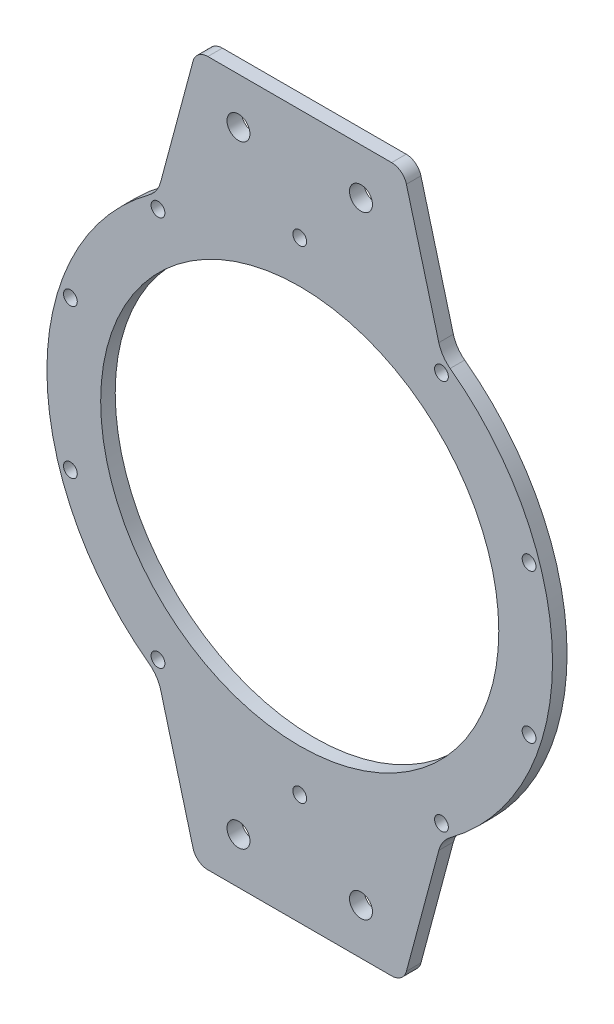
ISO-10303-21;
HEADER;
FILE_DESCRIPTION(('STEP AP214'),'2;1');
FILE_NAME('part.step','',(''),(''),'','','');
FILE_SCHEMA(('AUTOMOTIVE_DESIGN { 1 0 10303 214 1 1 1 1 }'));
ENDSEC;
DATA;
#1=APPLICATION_CONTEXT('core data for automotive mechanical design processes');
#2=APPLICATION_PROTOCOL_DEFINITION('international standard','automotive_design',2000,#1);
#3=PRODUCT_CONTEXT('',#1,'mechanical');
#4=PRODUCT('Part','Part','',(#3));
#5=PRODUCT_RELATED_PRODUCT_CATEGORY('part','',(#4));
#6=PRODUCT_DEFINITION_FORMATION('','',#4);
#7=PRODUCT_DEFINITION_CONTEXT('part definition',#1,'design');
#8=PRODUCT_DEFINITION('design','',#6,#7);
#9=PRODUCT_DEFINITION_SHAPE('','',#8);
#10=(LENGTH_UNIT() NAMED_UNIT(*) SI_UNIT(.MILLI.,.METRE.));
#11=(NAMED_UNIT(*) PLANE_ANGLE_UNIT() SI_UNIT($,.RADIAN.));
#12=(NAMED_UNIT(*) SI_UNIT($,.STERADIAN.) SOLID_ANGLE_UNIT());
#13=UNCERTAINTY_MEASURE_WITH_UNIT(LENGTH_MEASURE(1.E-05),#10,'distance_accuracy_value','');
#14=(GEOMETRIC_REPRESENTATION_CONTEXT(3) GLOBAL_UNCERTAINTY_ASSIGNED_CONTEXT((#13)) GLOBAL_UNIT_ASSIGNED_CONTEXT((#10,
#11,#12)) REPRESENTATION_CONTEXT('',''));
#15=CARTESIAN_POINT('',(0.,0.,0.));
#16=DIRECTION('',(0.,0.,1.));
#17=DIRECTION('',(1.,0.,0.));
#18=AXIS2_PLACEMENT_3D('',#15,#16,#17);
#19=CARTESIAN_POINT('',(55.0734289559144,74.3802387939018,2.3749));
#20=DIRECTION('',(0.,0.,1.));
#21=DIRECTION('',(1.,0.,0.));
#22=AXIS2_PLACEMENT_3D('',#19,#20,#21);
#23=PLANE('',#22);
#24=CARTESIAN_POINT('',(-20.,-100.,2.3749));
#25=DIRECTION('',(0.,0.,1.));
#26=DIRECTION('',(-1.,0.,0.));
#27=AXIS2_PLACEMENT_3D('',#24,#25,#26);
#28=CIRCLE('',#27,3.75);
#29=CARTESIAN_POINT('',(-23.75,-100.,2.3749));
#30=VERTEX_POINT('',#29);
#31=EDGE_CURVE('E387',#30,#30,#28,.T.);
#32=ORIENTED_EDGE('',*,*,#31,.F.);
#33=EDGE_LOOP('',(#32));
#34=FACE_BOUND('',#33,.T.);
#35=CARTESIAN_POINT('',(-74.8861900930804,24.3319981370833,2.3749));
#36=DIRECTION('',(0.,0.,1.));
#37=DIRECTION('',(1.,0.,0.));
#38=AXIS2_PLACEMENT_3D('',#35,#36,#37);
#39=CIRCLE('',#38,2.25);
#40=CARTESIAN_POINT('',(-72.6361900930804,24.3319981370833,2.3749));
#41=VERTEX_POINT('',#40);
#42=EDGE_CURVE('E399',#41,#41,#39,.T.);
#43=ORIENTED_EDGE('',*,*,#42,.F.);
#44=EDGE_LOOP('',(#43));
#45=FACE_BOUND('',#44,.T.);
#46=CARTESIAN_POINT('',(20.,100.,2.3749));
#47=DIRECTION('',(0.,0.,1.));
#48=DIRECTION('',(1.,0.,0.));
#49=AXIS2_PLACEMENT_3D('',#46,#47,#48);
#50=CIRCLE('',#49,3.75);
#51=CARTESIAN_POINT('',(23.75,100.,2.3749));
#52=VERTEX_POINT('',#51);
#53=EDGE_CURVE('E411',#52,#52,#50,.T.);
#54=ORIENTED_EDGE('',*,*,#53,.F.);
#55=EDGE_LOOP('',(#54));
#56=FACE_BOUND('',#55,.T.);
#57=CARTESIAN_POINT('',(-46.2822107655093,-63.7019981370834,2.3749));
#58=DIRECTION('',(0.,0.,1.));
#59=DIRECTION('',(1.,0.,0.));
#60=AXIS2_PLACEMENT_3D('',#57,#58,#59);
#61=CIRCLE('',#60,2.25);
#62=CARTESIAN_POINT('',(-44.0322107655093,-63.7019981370834,2.3749));
#63=VERTEX_POINT('',#62);
#64=EDGE_CURVE('E423',#63,#63,#61,.T.);
#65=ORIENTED_EDGE('',*,*,#64,.F.);
#66=EDGE_LOOP('',(#65));
#67=FACE_BOUND('',#66,.T.);
#68=CARTESIAN_POINT('',(46.2822107655093,-63.7019981370834,2.3749));
#69=DIRECTION('',(0.,0.,1.));
#70=DIRECTION('',(1.,0.,0.));
#71=AXIS2_PLACEMENT_3D('',#68,#69,#70);
#72=CIRCLE('',#71,2.25);
#73=CARTESIAN_POINT('',(48.5322107655093,-63.7019981370834,2.3749));
#74=VERTEX_POINT('',#73);
#75=EDGE_CURVE('E435',#74,#74,#72,.T.);
#76=ORIENTED_EDGE('',*,*,#75,.F.);
#77=EDGE_LOOP('',(#76));
#78=FACE_BOUND('',#77,.T.);
#79=CARTESIAN_POINT('',(74.8861900930804,24.3319981370834,2.3749));
#80=DIRECTION('',(0.,0.,1.));
#81=DIRECTION('',(1.,0.,0.));
#82=AXIS2_PLACEMENT_3D('',#79,#80,#81);
#83=CIRCLE('',#82,2.25);
#84=CARTESIAN_POINT('',(77.1361900930804,24.3319981370834,2.3749));
#85=VERTEX_POINT('',#84);
#86=EDGE_CURVE('E447',#85,#85,#83,.T.);
#87=ORIENTED_EDGE('',*,*,#86,.F.);
#88=EDGE_LOOP('',(#87));
#89=FACE_BOUND('',#88,.T.);
#90=CARTESIAN_POINT('',(0.,78.74,2.3749));
#91=DIRECTION('',(0.,0.,1.));
#92=DIRECTION('',(1.,0.,0.));
#93=AXIS2_PLACEMENT_3D('',#90,#91,#92);
#94=CIRCLE('',#93,2.25);
#95=CARTESIAN_POINT('',(2.25,78.74,2.3749));
#96=VERTEX_POINT('',#95);
#97=EDGE_CURVE('E459',#96,#96,#94,.T.);
#98=ORIENTED_EDGE('',*,*,#97,.F.);
#99=EDGE_LOOP('',(#98));
#100=FACE_BOUND('',#99,.T.);
#101=CARTESIAN_POINT('',(55.0734289559144,74.3802387939018,2.3749));
#102=DIRECTION('',(0.,0.,-1.));
#103=DIRECTION('',(1.,0.,0.));
#104=AXIS2_PLACEMENT_3D('',#101,#102,#103);
#105=CIRCLE('',#104,10.);
#106=CARTESIAN_POINT('',(49.1227613215639,66.3434760933181,2.3749));
#107=VERTEX_POINT('',#106);
#108=CARTESIAN_POINT('',(45.4141706930237,71.7920483428766,2.3749));
#109=VERTEX_POINT('',#108);
#110=EDGE_CURVE('E209',#107,#109,#105,.T.);
#111=ORIENTED_EDGE('',*,*,#110,.T.);
#112=DIRECTION('',(-0.258819045102514,0.96592582628907,0.));
#113=VECTOR('',#112,1.);
#114=CARTESIAN_POINT('',(34.8296291314454,111.294095225513,2.3749));
#115=LINE('',#114,#113);
#116=CARTESIAN_POINT('',(34.8296291314454,111.294095225513,2.3749));
#117=VERTEX_POINT('',#116);
#118=EDGE_CURVE('E117',#109,#117,#115,.T.);
#119=ORIENTED_EDGE('',*,*,#118,.T.);
#120=CARTESIAN_POINT('',(30.,110.,2.3749));
#121=DIRECTION('',(0.,0.,1.));
#122=DIRECTION('',(1.,0.,0.));
#123=AXIS2_PLACEMENT_3D('',#120,#121,#122);
#124=CIRCLE('',#123,4.99999999999997);
#125=CARTESIAN_POINT('',(30.,115.,2.3749));
#126=VERTEX_POINT('',#125);
#127=EDGE_CURVE('E248',#117,#126,#124,.T.);
#128=ORIENTED_EDGE('',*,*,#127,.T.);
#129=DIRECTION('',(-1.,0.,0.));
#130=VECTOR('',#129,1.);
#131=CARTESIAN_POINT('',(-30.,115.,2.3749));
#132=LINE('',#131,#130);
#133=CARTESIAN_POINT('',(-30.,115.,2.3749));
#134=VERTEX_POINT('',#133);
#135=EDGE_CURVE('E267',#126,#134,#132,.T.);
#136=ORIENTED_EDGE('',*,*,#135,.T.);
#137=CARTESIAN_POINT('',(-30.,110.,2.3749));
#138=DIRECTION('',(0.,0.,1.));
#139=DIRECTION('',(1.,0.,0.));
#140=AXIS2_PLACEMENT_3D('',#137,#138,#139);
#141=CIRCLE('',#140,5.);
#142=CARTESIAN_POINT('',(-34.8296291314453,111.294095225513,2.3749));
#143=VERTEX_POINT('',#142);
#144=EDGE_CURVE('E264',#134,#143,#141,.T.);
#145=ORIENTED_EDGE('',*,*,#144,.T.);
#146=DIRECTION('',(-0.258819045102514,-0.96592582628907,0.));
#147=VECTOR('',#146,1.);
#148=CARTESIAN_POINT('',(-45.4141706930237,71.7920483428766,2.3749));
#149=LINE('',#148,#147);
#150=CARTESIAN_POINT('',(-45.4141706930237,71.7920483428766,2.3749));
#151=VERTEX_POINT('',#150);
#152=EDGE_CURVE('E266',#143,#151,#149,.T.);
#153=ORIENTED_EDGE('',*,*,#152,.T.);
#154=CARTESIAN_POINT('',(-55.0734289559144,74.3802387939018,2.3749));
#155=DIRECTION('',(0.,0.,-1.));
#156=DIRECTION('',(-1.,0.,0.));
#157=AXIS2_PLACEMENT_3D('',#154,#155,#156);
#158=CIRCLE('',#157,10.);
#159=CARTESIAN_POINT('',(-49.1227613215638,66.3434760933181,2.3749));
#160=VERTEX_POINT('',#159);
#161=EDGE_CURVE('E269',#151,#160,#158,.T.);
#162=ORIENTED_EDGE('',*,*,#161,.T.);
#163=CARTESIAN_POINT('',(0.,0.,2.3749));
#164=DIRECTION('',(0.,0.,1.));
#165=DIRECTION('',(1.,0.,0.));
#166=AXIS2_PLACEMENT_3D('',#163,#164,#165);
#167=CIRCLE('',#166,82.55);
#168=CARTESIAN_POINT('',(-49.1227613215638,-66.3434760933181,2.3749));
#169=VERTEX_POINT('',#168);
#170=EDGE_CURVE('E275',#160,#169,#167,.T.);
#171=ORIENTED_EDGE('',*,*,#170,.T.);
#172=CARTESIAN_POINT('',(-55.0734289559144,-74.3802387939018,2.3749));
#173=DIRECTION('',(0.,0.,-1.));
#174=DIRECTION('',(1.,0.,0.));
#175=AXIS2_PLACEMENT_3D('',#172,#173,#174);
#176=CIRCLE('',#175,10.);
#177=CARTESIAN_POINT('',(-45.4141706930237,-71.7920483428766,2.3749));
#178=VERTEX_POINT('',#177);
#179=EDGE_CURVE('E277',#169,#178,#176,.T.);
#180=ORIENTED_EDGE('',*,*,#179,.T.);
#181=DIRECTION('',(0.258819045102514,-0.96592582628907,0.));
#182=VECTOR('',#181,1.);
#183=CARTESIAN_POINT('',(-45.4141706930237,-71.7920483428766,2.3749));
#184=LINE('',#183,#182);
#185=CARTESIAN_POINT('',(-34.8296291314453,-111.294095225513,2.3749));
#186=VERTEX_POINT('',#185);
#187=EDGE_CURVE('E279',#178,#186,#184,.T.);
#188=ORIENTED_EDGE('',*,*,#187,.T.);
#189=CARTESIAN_POINT('',(-30.,-110.,2.3749));
#190=DIRECTION('',(0.,0.,1.));
#191=DIRECTION('',(-1.,0.,0.));
#192=AXIS2_PLACEMENT_3D('',#189,#190,#191);
#193=CIRCLE('',#192,5.);
#194=CARTESIAN_POINT('',(-30.,-115.,2.3749));
#195=VERTEX_POINT('',#194);
#196=EDGE_CURVE('E281',#186,#195,#193,.T.);
#197=ORIENTED_EDGE('',*,*,#196,.T.);
#198=DIRECTION('',(1.,0.,0.));
#199=VECTOR('',#198,1.);
#200=CARTESIAN_POINT('',(-30.,-115.,2.3749));
#201=LINE('',#200,#199);
#202=CARTESIAN_POINT('',(30.,-115.,2.3749));
#203=VERTEX_POINT('',#202);
#204=EDGE_CURVE('E283',#195,#203,#201,.T.);
#205=ORIENTED_EDGE('',*,*,#204,.T.);
#206=CARTESIAN_POINT('',(30.,-110.,2.3749));
#207=DIRECTION('',(0.,0.,1.));
#208=DIRECTION('',(-1.,0.,0.));
#209=AXIS2_PLACEMENT_3D('',#206,#207,#208);
#210=CIRCLE('',#209,4.99999999999997);
#211=CARTESIAN_POINT('',(34.8296291314454,-111.294095225513,2.3749));
#212=VERTEX_POINT('',#211);
#213=EDGE_CURVE('E160',#203,#212,#210,.T.);
#214=ORIENTED_EDGE('',*,*,#213,.T.);
#215=DIRECTION('',(0.258819045102514,0.96592582628907,0.));
#216=VECTOR('',#215,1.);
#217=CARTESIAN_POINT('',(34.8296291314454,-111.294095225513,2.3749));
#218=LINE('',#217,#216);
#219=CARTESIAN_POINT('',(45.4141706930237,-71.7920483428766,2.3749));
#220=VERTEX_POINT('',#219);
#221=EDGE_CURVE('E154',#212,#220,#218,.T.);
#222=ORIENTED_EDGE('',*,*,#221,.T.);
#223=CARTESIAN_POINT('',(55.0734289559144,-74.3802387939018,2.3749));
#224=DIRECTION('',(0.,0.,-1.));
#225=DIRECTION('',(-1.,0.,0.));
#226=AXIS2_PLACEMENT_3D('',#223,#224,#225);
#227=CIRCLE('',#226,10.);
#228=CARTESIAN_POINT('',(49.1227613215638,-66.3434760933181,2.3749));
#229=VERTEX_POINT('',#228);
#230=EDGE_CURVE('E158',#220,#229,#227,.T.);
#231=ORIENTED_EDGE('',*,*,#230,.T.);
#232=CARTESIAN_POINT('',(0.,0.,2.3749));
#233=DIRECTION('',(0.,0.,1.));
#234=DIRECTION('',(1.,0.,0.));
#235=AXIS2_PLACEMENT_3D('',#232,#233,#234);
#236=CIRCLE('',#235,82.55);
#237=EDGE_CURVE('E50',#229,#107,#236,.T.);
#238=ORIENTED_EDGE('',*,*,#237,.T.);
#239=EDGE_LOOP('',(#111,#119,#128,#136,#145,#153,#162,#171,#180,#188,#197,#205,#214,#222,#231,#238));
#240=FACE_BOUND('',#239,.T.);
#241=CARTESIAN_POINT('',(0.,0.,2.3749));
#242=DIRECTION('',(0.,0.,1.));
#243=DIRECTION('',(1.,0.,0.));
#244=AXIS2_PLACEMENT_3D('',#241,#242,#243);
#245=CIRCLE('',#244,65.);
#246=CARTESIAN_POINT('',(65.,0.,2.3749));
#247=VERTEX_POINT('',#246);
#248=EDGE_CURVE('E182',#247,#247,#245,.T.);
#249=ORIENTED_EDGE('',*,*,#248,.F.);
#250=EDGE_LOOP('',(#249));
#251=FACE_BOUND('',#250,.T.);
#252=CARTESIAN_POINT('',(46.2822107655094,63.7019981370833,2.3749));
#253=DIRECTION('',(0.,0.,1.));
#254=DIRECTION('',(1.,0.,0.));
#255=AXIS2_PLACEMENT_3D('',#252,#253,#254);
#256=CIRCLE('',#255,2.25);
#257=CARTESIAN_POINT('',(48.5322107655094,63.7019981370833,2.3749));
#258=VERTEX_POINT('',#257);
#259=EDGE_CURVE('E453',#258,#258,#256,.T.);
#260=ORIENTED_EDGE('',*,*,#259,.F.);
#261=EDGE_LOOP('',(#260));
#262=FACE_BOUND('',#261,.T.);
#263=CARTESIAN_POINT('',(74.8861900930824,-24.331998137084,2.3749));
#264=DIRECTION('',(0.,0.,1.));
#265=DIRECTION('',(1.,0.,0.));
#266=AXIS2_PLACEMENT_3D('',#263,#264,#265);
#267=CIRCLE('',#266,2.25);
#268=CARTESIAN_POINT('',(77.1361900930824,-24.331998137084,2.3749));
#269=VERTEX_POINT('',#268);
#270=EDGE_CURVE('E441',#269,#269,#267,.T.);
#271=ORIENTED_EDGE('',*,*,#270,.F.);
#272=EDGE_LOOP('',(#271));
#273=FACE_BOUND('',#272,.T.);
#274=CARTESIAN_POINT('',(0.,-78.74,2.3749));
#275=DIRECTION('',(0.,0.,1.));
#276=DIRECTION('',(1.,0.,0.));
#277=AXIS2_PLACEMENT_3D('',#274,#275,#276);
#278=CIRCLE('',#277,2.25);
#279=CARTESIAN_POINT('',(2.25000000000001,-78.74,2.3749));
#280=VERTEX_POINT('',#279);
#281=EDGE_CURVE('E429',#280,#280,#278,.T.);
#282=ORIENTED_EDGE('',*,*,#281,.F.);
#283=EDGE_LOOP('',(#282));
#284=FACE_BOUND('',#283,.T.);
#285=CARTESIAN_POINT('',(-74.8861900930804,-24.3319981370834,2.3749));
#286=DIRECTION('',(0.,0.,1.));
#287=DIRECTION('',(1.,0.,0.));
#288=AXIS2_PLACEMENT_3D('',#285,#286,#287);
#289=CIRCLE('',#288,2.25);
#290=CARTESIAN_POINT('',(-72.6361900930804,-24.3319981370834,2.3749));
#291=VERTEX_POINT('',#290);
#292=EDGE_CURVE('E417',#291,#291,#289,.T.);
#293=ORIENTED_EDGE('',*,*,#292,.F.);
#294=EDGE_LOOP('',(#293));
#295=FACE_BOUND('',#294,.T.);
#296=CARTESIAN_POINT('',(-20.,100.,2.3749));
#297=DIRECTION('',(0.,0.,1.));
#298=DIRECTION('',(1.,0.,0.));
#299=AXIS2_PLACEMENT_3D('',#296,#297,#298);
#300=CIRCLE('',#299,3.75);
#301=CARTESIAN_POINT('',(-16.25,100.,2.3749));
#302=VERTEX_POINT('',#301);
#303=EDGE_CURVE('E405',#302,#302,#300,.T.);
#304=ORIENTED_EDGE('',*,*,#303,.F.);
#305=EDGE_LOOP('',(#304));
#306=FACE_BOUND('',#305,.T.);
#307=CARTESIAN_POINT('',(20.,-100.,2.3749));
#308=DIRECTION('',(0.,0.,1.));
#309=DIRECTION('',(-1.,0.,0.));
#310=AXIS2_PLACEMENT_3D('',#307,#308,#309);
#311=CIRCLE('',#310,3.75);
#312=CARTESIAN_POINT('',(16.25,-100.,2.3749));
#313=VERTEX_POINT('',#312);
#314=EDGE_CURVE('E393',#313,#313,#311,.T.);
#315=ORIENTED_EDGE('',*,*,#314,.F.);
#316=EDGE_LOOP('',(#315));
#317=FACE_BOUND('',#316,.T.);
#318=CARTESIAN_POINT('',(-46.2822107655085,63.701998137084,2.3749));
#319=DIRECTION('',(0.,0.,1.));
#320=DIRECTION('',(1.,0.,0.));
#321=AXIS2_PLACEMENT_3D('',#318,#319,#320);
#322=CIRCLE('',#321,2.25);
#323=CARTESIAN_POINT('',(-44.0322107655085,63.701998137084,2.3749));
#324=VERTEX_POINT('',#323);
#325=EDGE_CURVE('E378',#324,#324,#322,.T.);
#326=ORIENTED_EDGE('',*,*,#325,.F.);
#327=EDGE_LOOP('',(#326));
#328=FACE_BOUND('',#327,.T.);
#329=ADVANCED_FACE('F33',(#34,#45,#56,#67,#78,#89,#100,#240,#251,#262,#273,#284,#295,#306,#317,
#328),#23,.T.);
#330=CARTESIAN_POINT('',(55.0734289559144,74.3802387939018,-2.3749));
#331=DIRECTION('',(0.,0.,1.));
#332=DIRECTION('',(1.,0.,0.));
#333=AXIS2_PLACEMENT_3D('',#330,#331,#332);
#334=PLANE('',#333);
#335=CARTESIAN_POINT('',(55.0734289559144,74.3802387939018,-2.3749));
#336=DIRECTION('',(0.,0.,-1.));
#337=DIRECTION('',(1.,0.,0.));
#338=AXIS2_PLACEMENT_3D('',#335,#336,#337);
#339=CIRCLE('',#338,10.);
#340=CARTESIAN_POINT('',(49.1227613215639,66.3434760933181,-2.3749));
#341=VERTEX_POINT('',#340);
#342=CARTESIAN_POINT('',(45.4141706930237,71.7920483428766,-2.3749));
#343=VERTEX_POINT('',#342);
#344=EDGE_CURVE('E178',#341,#343,#339,.T.);
#345=ORIENTED_EDGE('',*,*,#344,.F.);
#346=CARTESIAN_POINT('',(0.,0.,-2.3749));
#347=DIRECTION('',(0.,0.,1.));
#348=DIRECTION('',(1.,0.,0.));
#349=AXIS2_PLACEMENT_3D('',#346,#347,#348);
#350=CIRCLE('',#349,82.55);
#351=CARTESIAN_POINT('',(49.1227613215638,-66.3434760933181,-2.3749));
#352=VERTEX_POINT('',#351);
#353=EDGE_CURVE('E109',#352,#341,#350,.T.);
#354=ORIENTED_EDGE('',*,*,#353,.F.);
#355=CARTESIAN_POINT('',(55.0734289559144,-74.3802387939018,-2.3749));
#356=DIRECTION('',(0.,0.,-1.));
#357=DIRECTION('',(-1.,0.,0.));
#358=AXIS2_PLACEMENT_3D('',#355,#356,#357);
#359=CIRCLE('',#358,10.);
#360=CARTESIAN_POINT('',(45.4141706930237,-71.7920483428766,-2.3749));
#361=VERTEX_POINT('',#360);
#362=EDGE_CURVE('E103',#361,#352,#359,.T.);
#363=ORIENTED_EDGE('',*,*,#362,.F.);
#364=DIRECTION('',(0.258819045102514,0.96592582628907,0.));
#365=VECTOR('',#364,1.);
#366=CARTESIAN_POINT('',(34.8296291314454,-111.294095225513,-2.3749));
#367=LINE('',#366,#365);
#368=CARTESIAN_POINT('',(34.8296291314454,-111.294095225513,-2.3749));
#369=VERTEX_POINT('',#368);
#370=EDGE_CURVE('E168',#369,#361,#367,.T.);
#371=ORIENTED_EDGE('',*,*,#370,.F.);
#372=CARTESIAN_POINT('',(30.,-110.,-2.3749));
#373=DIRECTION('',(0.,0.,1.));
#374=DIRECTION('',(-1.,0.,0.));
#375=AXIS2_PLACEMENT_3D('',#372,#373,#374);
#376=CIRCLE('',#375,4.99999999999997);
#377=CARTESIAN_POINT('',(30.,-115.,-2.3749));
#378=VERTEX_POINT('',#377);
#379=EDGE_CURVE('E204',#378,#369,#376,.T.);
#380=ORIENTED_EDGE('',*,*,#379,.F.);
#381=DIRECTION('',(1.,0.,0.));
#382=VECTOR('',#381,1.);
#383=CARTESIAN_POINT('',(-30.,-115.,-2.3749));
#384=LINE('',#383,#382);
#385=CARTESIAN_POINT('',(-30.,-115.,-2.3749));
#386=VERTEX_POINT('',#385);
#387=EDGE_CURVE('E202',#386,#378,#384,.T.);
#388=ORIENTED_EDGE('',*,*,#387,.F.);
#389=CARTESIAN_POINT('',(-30.,-110.,-2.3749));
#390=DIRECTION('',(0.,0.,1.));
#391=DIRECTION('',(-1.,0.,0.));
#392=AXIS2_PLACEMENT_3D('',#389,#390,#391);
#393=CIRCLE('',#392,5.);
#394=CARTESIAN_POINT('',(-34.8296291314453,-111.294095225513,-2.3749));
#395=VERTEX_POINT('',#394);
#396=EDGE_CURVE('E200',#395,#386,#393,.T.);
#397=ORIENTED_EDGE('',*,*,#396,.F.);
#398=DIRECTION('',(0.258819045102514,-0.96592582628907,0.));
#399=VECTOR('',#398,1.);
#400=CARTESIAN_POINT('',(-45.4141706930237,-71.7920483428766,-2.3749));
#401=LINE('',#400,#399);
#402=CARTESIAN_POINT('',(-45.4141706930237,-71.7920483428766,-2.3749));
#403=VERTEX_POINT('',#402);
#404=EDGE_CURVE('E198',#403,#395,#401,.T.);
#405=ORIENTED_EDGE('',*,*,#404,.F.);
#406=CARTESIAN_POINT('',(-55.0734289559144,-74.3802387939018,-2.3749));
#407=DIRECTION('',(0.,0.,-1.));
#408=DIRECTION('',(1.,0.,0.));
#409=AXIS2_PLACEMENT_3D('',#406,#407,#408);
#410=CIRCLE('',#409,10.);
#411=CARTESIAN_POINT('',(-49.1227613215638,-66.3434760933181,-2.3749));
#412=VERTEX_POINT('',#411);
#413=EDGE_CURVE('E196',#412,#403,#410,.T.);
#414=ORIENTED_EDGE('',*,*,#413,.F.);
#415=CARTESIAN_POINT('',(0.,0.,-2.3749));
#416=DIRECTION('',(0.,0.,1.));
#417=DIRECTION('',(1.,0.,0.));
#418=AXIS2_PLACEMENT_3D('',#415,#416,#417);
#419=CIRCLE('',#418,82.55);
#420=CARTESIAN_POINT('',(-49.1227613215638,66.3434760933181,-2.3749));
#421=VERTEX_POINT('',#420);
#422=EDGE_CURVE('E194',#421,#412,#419,.T.);
#423=ORIENTED_EDGE('',*,*,#422,.F.);
#424=CARTESIAN_POINT('',(-55.0734289559144,74.3802387939018,-2.3749));
#425=DIRECTION('',(0.,0.,-1.));
#426=DIRECTION('',(-1.,0.,0.));
#427=AXIS2_PLACEMENT_3D('',#424,#425,#426);
#428=CIRCLE('',#427,10.);
#429=CARTESIAN_POINT('',(-45.4141706930237,71.7920483428766,-2.3749));
#430=VERTEX_POINT('',#429);
#431=EDGE_CURVE('E192',#430,#421,#428,.T.);
#432=ORIENTED_EDGE('',*,*,#431,.F.);
#433=DIRECTION('',(-0.258819045102514,-0.96592582628907,0.));
#434=VECTOR('',#433,1.);
#435=CARTESIAN_POINT('',(-45.4141706930237,71.7920483428766,-2.3749));
#436=LINE('',#435,#434);
#437=CARTESIAN_POINT('',(-34.8296291314453,111.294095225513,-2.3749));
#438=VERTEX_POINT('',#437);
#439=EDGE_CURVE('E190',#438,#430,#436,.T.);
#440=ORIENTED_EDGE('',*,*,#439,.F.);
#441=CARTESIAN_POINT('',(-30.,110.,-2.3749));
#442=DIRECTION('',(0.,0.,1.));
#443=DIRECTION('',(1.,0.,0.));
#444=AXIS2_PLACEMENT_3D('',#441,#442,#443);
#445=CIRCLE('',#444,5.);
#446=CARTESIAN_POINT('',(-30.,115.,-2.3749));
#447=VERTEX_POINT('',#446);
#448=EDGE_CURVE('E188',#447,#438,#445,.T.);
#449=ORIENTED_EDGE('',*,*,#448,.F.);
#450=DIRECTION('',(-1.,0.,0.));
#451=VECTOR('',#450,1.);
#452=CARTESIAN_POINT('',(-30.,115.,-2.3749));
#453=LINE('',#452,#451);
#454=CARTESIAN_POINT('',(30.,115.,-2.3749));
#455=VERTEX_POINT('',#454);
#456=EDGE_CURVE('E186',#455,#447,#453,.T.);
#457=ORIENTED_EDGE('',*,*,#456,.F.);
#458=CARTESIAN_POINT('',(30.,110.,-2.3749));
#459=DIRECTION('',(0.,0.,1.));
#460=DIRECTION('',(1.,0.,0.));
#461=AXIS2_PLACEMENT_3D('',#458,#459,#460);
#462=CIRCLE('',#461,4.99999999999997);
#463=CARTESIAN_POINT('',(34.8296291314454,111.294095225513,-2.3749));
#464=VERTEX_POINT('',#463);
#465=EDGE_CURVE('E184',#464,#455,#462,.T.);
#466=ORIENTED_EDGE('',*,*,#465,.F.);
#467=DIRECTION('',(-0.258819045102514,0.96592582628907,0.));
#468=VECTOR('',#467,1.);
#469=CARTESIAN_POINT('',(34.8296291314454,111.294095225513,-2.3749));
#470=LINE('',#469,#468);
#471=EDGE_CURVE('E181',#343,#464,#470,.T.);
#472=ORIENTED_EDGE('',*,*,#471,.F.);
#473=EDGE_LOOP('',(#345,#354,#363,#371,#380,#388,#397,#405,#414,#423,#432,#440,#449,#457,#466,#472));
#474=FACE_BOUND('',#473,.T.);
#475=CARTESIAN_POINT('',(0.,0.,-2.3749));
#476=DIRECTION('',(0.,0.,1.));
#477=DIRECTION('',(1.,0.,0.));
#478=AXIS2_PLACEMENT_3D('',#475,#476,#477);
#479=CIRCLE('',#478,65.);
#480=CARTESIAN_POINT('',(65.,0.,-2.3749));
#481=VERTEX_POINT('',#480);
#482=EDGE_CURVE('E462',#481,#481,#479,.T.);
#483=ORIENTED_EDGE('',*,*,#482,.T.);
#484=EDGE_LOOP('',(#483));
#485=FACE_BOUND('',#484,.T.);
#486=CARTESIAN_POINT('',(0.,78.74,-2.3749));
#487=DIRECTION('',(0.,0.,1.));
#488=DIRECTION('',(1.,0.,0.));
#489=AXIS2_PLACEMENT_3D('',#486,#487,#488);
#490=CIRCLE('',#489,2.25);
#491=CARTESIAN_POINT('',(2.25,78.74,-2.3749));
#492=VERTEX_POINT('',#491);
#493=EDGE_CURVE('E456',#492,#492,#490,.T.);
#494=ORIENTED_EDGE('',*,*,#493,.T.);
#495=EDGE_LOOP('',(#494));
#496=FACE_BOUND('',#495,.T.);
#497=CARTESIAN_POINT('',(46.2822107655094,63.7019981370833,-2.3749));
#498=DIRECTION('',(0.,0.,1.));
#499=DIRECTION('',(1.,0.,0.));
#500=AXIS2_PLACEMENT_3D('',#497,#498,#499);
#501=CIRCLE('',#500,2.25);
#502=CARTESIAN_POINT('',(48.5322107655094,63.7019981370833,-2.3749));
#503=VERTEX_POINT('',#502);
#504=EDGE_CURVE('E450',#503,#503,#501,.T.);
#505=ORIENTED_EDGE('',*,*,#504,.T.);
#506=EDGE_LOOP('',(#505));
#507=FACE_BOUND('',#506,.T.);
#508=CARTESIAN_POINT('',(74.8861900930804,24.3319981370834,-2.3749));
#509=DIRECTION('',(0.,0.,1.));
#510=DIRECTION('',(1.,0.,0.));
#511=AXIS2_PLACEMENT_3D('',#508,#509,#510);
#512=CIRCLE('',#511,2.25);
#513=CARTESIAN_POINT('',(77.1361900930804,24.3319981370834,-2.3749));
#514=VERTEX_POINT('',#513);
#515=EDGE_CURVE('E444',#514,#514,#512,.T.);
#516=ORIENTED_EDGE('',*,*,#515,.T.);
#517=EDGE_LOOP('',(#516));
#518=FACE_BOUND('',#517,.T.);
#519=CARTESIAN_POINT('',(74.8861900930824,-24.331998137084,-2.3749));
#520=DIRECTION('',(0.,0.,1.));
#521=DIRECTION('',(1.,0.,0.));
#522=AXIS2_PLACEMENT_3D('',#519,#520,#521);
#523=CIRCLE('',#522,2.25);
#524=CARTESIAN_POINT('',(77.1361900930824,-24.331998137084,-2.3749));
#525=VERTEX_POINT('',#524);
#526=EDGE_CURVE('E438',#525,#525,#523,.T.);
#527=ORIENTED_EDGE('',*,*,#526,.T.);
#528=EDGE_LOOP('',(#527));
#529=FACE_BOUND('',#528,.T.);
#530=CARTESIAN_POINT('',(46.2822107655093,-63.7019981370834,-2.3749));
#531=DIRECTION('',(0.,0.,1.));
#532=DIRECTION('',(1.,0.,0.));
#533=AXIS2_PLACEMENT_3D('',#530,#531,#532);
#534=CIRCLE('',#533,2.25);
#535=CARTESIAN_POINT('',(48.5322107655093,-63.7019981370834,-2.3749));
#536=VERTEX_POINT('',#535);
#537=EDGE_CURVE('E432',#536,#536,#534,.T.);
#538=ORIENTED_EDGE('',*,*,#537,.T.);
#539=EDGE_LOOP('',(#538));
#540=FACE_BOUND('',#539,.T.);
#541=CARTESIAN_POINT('',(0.,-78.74,-2.3749));
#542=DIRECTION('',(0.,0.,1.));
#543=DIRECTION('',(1.,0.,0.));
#544=AXIS2_PLACEMENT_3D('',#541,#542,#543);
#545=CIRCLE('',#544,2.25);
#546=CARTESIAN_POINT('',(2.25000000000001,-78.74,-2.3749));
#547=VERTEX_POINT('',#546);
#548=EDGE_CURVE('E426',#547,#547,#545,.T.);
#549=ORIENTED_EDGE('',*,*,#548,.T.);
#550=EDGE_LOOP('',(#549));
#551=FACE_BOUND('',#550,.T.);
#552=CARTESIAN_POINT('',(-46.2822107655093,-63.7019981370834,-2.3749));
#553=DIRECTION('',(0.,0.,1.));
#554=DIRECTION('',(1.,0.,0.));
#555=AXIS2_PLACEMENT_3D('',#552,#553,#554);
#556=CIRCLE('',#555,2.25);
#557=CARTESIAN_POINT('',(-44.0322107655093,-63.7019981370834,-2.3749));
#558=VERTEX_POINT('',#557);
#559=EDGE_CURVE('E420',#558,#558,#556,.T.);
#560=ORIENTED_EDGE('',*,*,#559,.T.);
#561=EDGE_LOOP('',(#560));
#562=FACE_BOUND('',#561,.T.);
#563=CARTESIAN_POINT('',(-74.8861900930804,-24.3319981370834,-2.3749));
#564=DIRECTION('',(0.,0.,1.));
#565=DIRECTION('',(1.,0.,0.));
#566=AXIS2_PLACEMENT_3D('',#563,#564,#565);
#567=CIRCLE('',#566,2.25);
#568=CARTESIAN_POINT('',(-72.6361900930804,-24.3319981370834,-2.3749));
#569=VERTEX_POINT('',#568);
#570=EDGE_CURVE('E414',#569,#569,#567,.T.);
#571=ORIENTED_EDGE('',*,*,#570,.T.);
#572=EDGE_LOOP('',(#571));
#573=FACE_BOUND('',#572,.T.);
#574=CARTESIAN_POINT('',(20.,100.,-2.3749));
#575=DIRECTION('',(0.,0.,1.));
#576=DIRECTION('',(1.,0.,0.));
#577=AXIS2_PLACEMENT_3D('',#574,#575,#576);
#578=CIRCLE('',#577,3.75);
#579=CARTESIAN_POINT('',(23.75,100.,-2.3749));
#580=VERTEX_POINT('',#579);
#581=EDGE_CURVE('E408',#580,#580,#578,.T.);
#582=ORIENTED_EDGE('',*,*,#581,.T.);
#583=EDGE_LOOP('',(#582));
#584=FACE_BOUND('',#583,.T.);
#585=CARTESIAN_POINT('',(-20.,100.,-2.3749));
#586=DIRECTION('',(0.,0.,1.));
#587=DIRECTION('',(1.,0.,0.));
#588=AXIS2_PLACEMENT_3D('',#585,#586,#587);
#589=CIRCLE('',#588,3.75);
#590=CARTESIAN_POINT('',(-16.25,100.,-2.3749));
#591=VERTEX_POINT('',#590);
#592=EDGE_CURVE('E402',#591,#591,#589,.T.);
#593=ORIENTED_EDGE('',*,*,#592,.T.);
#594=EDGE_LOOP('',(#593));
#595=FACE_BOUND('',#594,.T.);
#596=CARTESIAN_POINT('',(-74.8861900930804,24.3319981370833,-2.3749));
#597=DIRECTION('',(0.,0.,1.));
#598=DIRECTION('',(1.,0.,0.));
#599=AXIS2_PLACEMENT_3D('',#596,#597,#598);
#600=CIRCLE('',#599,2.25);
#601=CARTESIAN_POINT('',(-72.6361900930804,24.3319981370833,-2.3749));
#602=VERTEX_POINT('',#601);
#603=EDGE_CURVE('E396',#602,#602,#600,.T.);
#604=ORIENTED_EDGE('',*,*,#603,.T.);
#605=EDGE_LOOP('',(#604));
#606=FACE_BOUND('',#605,.T.);
#607=CARTESIAN_POINT('',(20.,-100.,-2.3749));
#608=DIRECTION('',(0.,0.,1.));
#609=DIRECTION('',(-1.,0.,0.));
#610=AXIS2_PLACEMENT_3D('',#607,#608,#609);
#611=CIRCLE('',#610,3.75);
#612=CARTESIAN_POINT('',(16.25,-100.,-2.3749));
#613=VERTEX_POINT('',#612);
#614=EDGE_CURVE('E390',#613,#613,#611,.T.);
#615=ORIENTED_EDGE('',*,*,#614,.T.);
#616=EDGE_LOOP('',(#615));
#617=FACE_BOUND('',#616,.T.);
#618=CARTESIAN_POINT('',(-20.,-100.,-2.3749));
#619=DIRECTION('',(0.,0.,1.));
#620=DIRECTION('',(-1.,0.,0.));
#621=AXIS2_PLACEMENT_3D('',#618,#619,#620);
#622=CIRCLE('',#621,3.75);
#623=CARTESIAN_POINT('',(-23.75,-100.,-2.3749));
#624=VERTEX_POINT('',#623);
#625=EDGE_CURVE('E384',#624,#624,#622,.T.);
#626=ORIENTED_EDGE('',*,*,#625,.T.);
#627=EDGE_LOOP('',(#626));
#628=FACE_BOUND('',#627,.T.);
#629=CARTESIAN_POINT('',(-46.2822107655085,63.701998137084,-2.3749));
#630=DIRECTION('',(0.,0.,1.));
#631=DIRECTION('',(1.,0.,0.));
#632=AXIS2_PLACEMENT_3D('',#629,#630,#631);
#633=CIRCLE('',#632,2.25);
#634=CARTESIAN_POINT('',(-44.0322107655085,63.701998137084,-2.3749));
#635=VERTEX_POINT('',#634);
#636=EDGE_CURVE('E381',#635,#635,#633,.T.);
#637=ORIENTED_EDGE('',*,*,#636,.T.);
#638=EDGE_LOOP('',(#637));
#639=FACE_BOUND('',#638,.T.);
#640=ADVANCED_FACE('F252',(#474,#485,#496,#507,#518,#529,#540,#551,#562,#573,#584,#595,#606,
#617,#628,#639),#334,.F.);
#641=CARTESIAN_POINT('',(55.0734289559144,74.3802387939018,2.3749));
#642=DIRECTION('',(0.,0.,-1.));
#643=DIRECTION('',(-1.,0.,0.));
#644=AXIS2_PLACEMENT_3D('',#641,#642,#643);
#645=CYLINDRICAL_SURFACE('',#644,10.);
#646=ORIENTED_EDGE('',*,*,#344,.T.);
#647=DIRECTION('',(0.,0.,-1.));
#648=VECTOR('',#647,1.);
#649=CARTESIAN_POINT('',(45.4141706930237,71.7920483428766,2.3749));
#650=LINE('',#649,#648);
#651=EDGE_CURVE('E11',#109,#343,#650,.T.);
#652=ORIENTED_EDGE('',*,*,#651,.F.);
#653=ORIENTED_EDGE('',*,*,#110,.F.);
#654=DIRECTION('',(0.,0.,-1.));
#655=VECTOR('',#654,1.);
#656=CARTESIAN_POINT('',(49.1227613215639,66.3434760933181,2.3749));
#657=LINE('',#656,#655);
#658=EDGE_CURVE('E174',#107,#341,#657,.T.);
#659=ORIENTED_EDGE('',*,*,#658,.T.);
#660=EDGE_LOOP('',(#646,#652,#653,#659));
#661=FACE_BOUND('',#660,.T.);
#662=ADVANCED_FACE('F35',(#661),#645,.F.);
#663=CARTESIAN_POINT('',(34.8296291314454,111.294095225513,2.3749));
#664=DIRECTION('',(-0.96592582628907,-0.258819045102514,0.));
#665=DIRECTION('',(0.258819045102514,-0.96592582628907,0.));
#666=AXIS2_PLACEMENT_3D('',#663,#664,#665);
#667=PLANE('',#666);
#668=ORIENTED_EDGE('',*,*,#471,.T.);
#669=DIRECTION('',(0.,0.,-1.));
#670=VECTOR('',#669,1.);
#671=CARTESIAN_POINT('',(34.8296291314454,111.294095225513,2.3749));
#672=LINE('',#671,#670);
#673=EDGE_CURVE('E42',#117,#464,#672,.T.);
#674=ORIENTED_EDGE('',*,*,#673,.F.);
#675=ORIENTED_EDGE('',*,*,#118,.F.);
#676=ORIENTED_EDGE('',*,*,#651,.T.);
#677=EDGE_LOOP('',(#668,#674,#675,#676));
#678=FACE_BOUND('',#677,.T.);
#679=ADVANCED_FACE('F711',(#678),#667,.F.);
#680=CARTESIAN_POINT('',(30.,110.,2.3749));
#681=DIRECTION('',(0.,0.,-1.));
#682=DIRECTION('',(-1.,0.,0.));
#683=AXIS2_PLACEMENT_3D('',#680,#681,#682);
#684=CYLINDRICAL_SURFACE('',#683,4.99999999999997);
#685=ORIENTED_EDGE('',*,*,#465,.T.);
#686=DIRECTION('',(0.,0.,-1.));
#687=VECTOR('',#686,1.);
#688=CARTESIAN_POINT('',(30.,115.,2.3749));
#689=LINE('',#688,#687);
#690=EDGE_CURVE('E240',#126,#455,#689,.T.);
#691=ORIENTED_EDGE('',*,*,#690,.F.);
#692=ORIENTED_EDGE('',*,*,#127,.F.);
#693=ORIENTED_EDGE('',*,*,#673,.T.);
#694=EDGE_LOOP('',(#685,#691,#692,#693));
#695=FACE_BOUND('',#694,.T.);
#696=ADVANCED_FACE('F246',(#695),#684,.T.);
#697=CARTESIAN_POINT('',(-30.,115.,2.3749));
#698=DIRECTION('',(0.,-1.,0.));
#699=DIRECTION('',(0.,0.,-1.));
#700=AXIS2_PLACEMENT_3D('',#697,#698,#699);
#701=PLANE('',#700);
#702=ORIENTED_EDGE('',*,*,#456,.T.);
#703=DIRECTION('',(0.,0.,-1.));
#704=VECTOR('',#703,1.);
#705=CARTESIAN_POINT('',(-30.,115.,2.3749));
#706=LINE('',#705,#704);
#707=EDGE_CURVE('E237',#134,#447,#706,.T.);
#708=ORIENTED_EDGE('',*,*,#707,.F.);
#709=ORIENTED_EDGE('',*,*,#135,.F.);
#710=ORIENTED_EDGE('',*,*,#690,.T.);
#711=EDGE_LOOP('',(#702,#708,#709,#710));
#712=FACE_BOUND('',#711,.T.);
#713=ADVANCED_FACE('F258',(#712),#701,.F.);
#714=CARTESIAN_POINT('',(-30.,110.,2.3749));
#715=DIRECTION('',(0.,0.,-1.));
#716=DIRECTION('',(-1.,0.,0.));
#717=AXIS2_PLACEMENT_3D('',#714,#715,#716);
#718=CYLINDRICAL_SURFACE('',#717,5.);
#719=ORIENTED_EDGE('',*,*,#448,.T.);
#720=DIRECTION('',(0.,0.,-1.));
#721=VECTOR('',#720,1.);
#722=CARTESIAN_POINT('',(-34.8296291314453,111.294095225513,2.3749));
#723=LINE('',#722,#721);
#724=EDGE_CURVE('E234',#143,#438,#723,.T.);
#725=ORIENTED_EDGE('',*,*,#724,.F.);
#726=ORIENTED_EDGE('',*,*,#144,.F.);
#727=ORIENTED_EDGE('',*,*,#707,.T.);
#728=EDGE_LOOP('',(#719,#725,#726,#727));
#729=FACE_BOUND('',#728,.T.);
#730=ADVANCED_FACE('F262',(#729),#718,.T.);
#731=CARTESIAN_POINT('',(-45.4141706930237,71.7920483428766,2.3749));
#732=DIRECTION('',(0.96592582628907,-0.258819045102514,0.));
#733=DIRECTION('',(0.258819045102514,0.96592582628907,0.));
#734=AXIS2_PLACEMENT_3D('',#731,#732,#733);
#735=PLANE('',#734);
#736=ORIENTED_EDGE('',*,*,#439,.T.);
#737=DIRECTION('',(0.,0.,-1.));
#738=VECTOR('',#737,1.);
#739=CARTESIAN_POINT('',(-45.4141706930237,71.7920483428766,2.3749));
#740=LINE('',#739,#738);
#741=EDGE_CURVE('E231',#151,#430,#740,.T.);
#742=ORIENTED_EDGE('',*,*,#741,.F.);
#743=ORIENTED_EDGE('',*,*,#152,.F.);
#744=ORIENTED_EDGE('',*,*,#724,.T.);
#745=EDGE_LOOP('',(#736,#742,#743,#744));
#746=FACE_BOUND('',#745,.T.);
#747=ADVANCED_FACE('F676',(#746),#735,.F.);
#748=CARTESIAN_POINT('',(-55.0734289559144,74.3802387939018,2.3749));
#749=DIRECTION('',(0.,0.,-1.));
#750=DIRECTION('',(-1.,0.,0.));
#751=AXIS2_PLACEMENT_3D('',#748,#749,#750);
#752=CYLINDRICAL_SURFACE('',#751,10.);
#753=ORIENTED_EDGE('',*,*,#431,.T.);
#754=DIRECTION('',(0.,0.,-1.));
#755=VECTOR('',#754,1.);
#756=CARTESIAN_POINT('',(-49.1227613215638,66.3434760933181,2.3749));
#757=LINE('',#756,#755);
#758=EDGE_CURVE('E228',#160,#421,#757,.T.);
#759=ORIENTED_EDGE('',*,*,#758,.F.);
#760=ORIENTED_EDGE('',*,*,#161,.F.);
#761=ORIENTED_EDGE('',*,*,#741,.T.);
#762=EDGE_LOOP('',(#753,#759,#760,#761));
#763=FACE_BOUND('',#762,.T.);
#764=ADVANCED_FACE('F666',(#763),#752,.F.);
#765=CARTESIAN_POINT('',(0.,0.,2.3749));
#766=DIRECTION('',(0.,0.,-1.));
#767=DIRECTION('',(-1.,0.,0.));
#768=AXIS2_PLACEMENT_3D('',#765,#766,#767);
#769=CYLINDRICAL_SURFACE('',#768,82.55);
#770=ORIENTED_EDGE('',*,*,#422,.T.);
#771=DIRECTION('',(0.,0.,-1.));
#772=VECTOR('',#771,1.);
#773=CARTESIAN_POINT('',(-49.1227613215638,-66.3434760933181,2.3749));
#774=LINE('',#773,#772);
#775=EDGE_CURVE('E225',#169,#412,#774,.T.);
#776=ORIENTED_EDGE('',*,*,#775,.F.);
#777=ORIENTED_EDGE('',*,*,#170,.F.);
#778=ORIENTED_EDGE('',*,*,#758,.T.);
#779=EDGE_LOOP('',(#770,#776,#777,#778));
#780=FACE_BOUND('',#779,.T.);
#781=ADVANCED_FACE('F656',(#780),#769,.T.);
#782=CARTESIAN_POINT('',(-55.0734289559144,-74.3802387939018,2.3749));
#783=DIRECTION('',(0.,0.,-1.));
#784=DIRECTION('',(-1.,0.,0.));
#785=AXIS2_PLACEMENT_3D('',#782,#783,#784);
#786=CYLINDRICAL_SURFACE('',#785,10.);
#787=ORIENTED_EDGE('',*,*,#413,.T.);
#788=DIRECTION('',(0.,0.,-1.));
#789=VECTOR('',#788,1.);
#790=CARTESIAN_POINT('',(-45.4141706930237,-71.7920483428766,2.3749));
#791=LINE('',#790,#789);
#792=EDGE_CURVE('E222',#178,#403,#791,.T.);
#793=ORIENTED_EDGE('',*,*,#792,.F.);
#794=ORIENTED_EDGE('',*,*,#179,.F.);
#795=ORIENTED_EDGE('',*,*,#775,.T.);
#796=EDGE_LOOP('',(#787,#793,#794,#795));
#797=FACE_BOUND('',#796,.T.);
#798=ADVANCED_FACE('F646',(#797),#786,.F.);
#799=CARTESIAN_POINT('',(-45.4141706930237,-71.7920483428766,2.3749));
#800=DIRECTION('',(0.96592582628907,0.258819045102514,0.));
#801=DIRECTION('',(-0.258819045102514,0.96592582628907,0.));
#802=AXIS2_PLACEMENT_3D('',#799,#800,#801);
#803=PLANE('',#802);
#804=ORIENTED_EDGE('',*,*,#404,.T.);
#805=DIRECTION('',(0.,0.,-1.));
#806=VECTOR('',#805,1.);
#807=CARTESIAN_POINT('',(-34.8296291314453,-111.294095225513,2.3749));
#808=LINE('',#807,#806);
#809=EDGE_CURVE('E219',#186,#395,#808,.T.);
#810=ORIENTED_EDGE('',*,*,#809,.F.);
#811=ORIENTED_EDGE('',*,*,#187,.F.);
#812=ORIENTED_EDGE('',*,*,#792,.T.);
#813=EDGE_LOOP('',(#804,#810,#811,#812));
#814=FACE_BOUND('',#813,.T.);
#815=ADVANCED_FACE('F636',(#814),#803,.F.);
#816=CARTESIAN_POINT('',(-30.,-110.,2.3749));
#817=DIRECTION('',(0.,0.,-1.));
#818=DIRECTION('',(-1.,0.,0.));
#819=AXIS2_PLACEMENT_3D('',#816,#817,#818);
#820=CYLINDRICAL_SURFACE('',#819,5.);
#821=ORIENTED_EDGE('',*,*,#396,.T.);
#822=DIRECTION('',(0.,0.,-1.));
#823=VECTOR('',#822,1.);
#824=CARTESIAN_POINT('',(-30.,-115.,2.3749));
#825=LINE('',#824,#823);
#826=EDGE_CURVE('E216',#195,#386,#825,.T.);
#827=ORIENTED_EDGE('',*,*,#826,.F.);
#828=ORIENTED_EDGE('',*,*,#196,.F.);
#829=ORIENTED_EDGE('',*,*,#809,.T.);
#830=EDGE_LOOP('',(#821,#827,#828,#829));
#831=FACE_BOUND('',#830,.T.);
#832=ADVANCED_FACE('F627',(#831),#820,.T.);
#833=CARTESIAN_POINT('',(-30.,-115.,2.3749));
#834=DIRECTION('',(0.,1.,0.));
#835=DIRECTION('',(0.,0.,1.));
#836=AXIS2_PLACEMENT_3D('',#833,#834,#835);
#837=PLANE('',#836);
#838=ORIENTED_EDGE('',*,*,#387,.T.);
#839=DIRECTION('',(0.,0.,-1.));
#840=VECTOR('',#839,1.);
#841=CARTESIAN_POINT('',(30.,-115.,2.3749));
#842=LINE('',#841,#840);
#843=EDGE_CURVE('E213',#203,#378,#842,.T.);
#844=ORIENTED_EDGE('',*,*,#843,.F.);
#845=ORIENTED_EDGE('',*,*,#204,.F.);
#846=ORIENTED_EDGE('',*,*,#826,.T.);
#847=EDGE_LOOP('',(#838,#844,#845,#846));
#848=FACE_BOUND('',#847,.T.);
#849=ADVANCED_FACE('F289',(#848),#837,.F.);
#850=CARTESIAN_POINT('',(30.,-110.,2.3749));
#851=DIRECTION('',(0.,0.,-1.));
#852=DIRECTION('',(-1.,0.,0.));
#853=AXIS2_PLACEMENT_3D('',#850,#851,#852);
#854=CYLINDRICAL_SURFACE('',#853,4.99999999999997);
#855=ORIENTED_EDGE('',*,*,#379,.T.);
#856=DIRECTION('',(0.,0.,-1.));
#857=VECTOR('',#856,1.);
#858=CARTESIAN_POINT('',(34.8296291314454,-111.294095225513,2.3749));
#859=LINE('',#858,#857);
#860=EDGE_CURVE('E169',#212,#369,#859,.T.);
#861=ORIENTED_EDGE('',*,*,#860,.F.);
#862=ORIENTED_EDGE('',*,*,#213,.F.);
#863=ORIENTED_EDGE('',*,*,#843,.T.);
#864=EDGE_LOOP('',(#855,#861,#862,#863));
#865=FACE_BOUND('',#864,.T.);
#866=ADVANCED_FACE('F293',(#865),#854,.T.);
#867=CARTESIAN_POINT('',(34.8296291314454,-111.294095225513,2.3749));
#868=DIRECTION('',(-0.96592582628907,0.258819045102514,0.));
#869=DIRECTION('',(-0.258819045102514,-0.96592582628907,0.));
#870=AXIS2_PLACEMENT_3D('',#867,#868,#869);
#871=PLANE('',#870);
#872=ORIENTED_EDGE('',*,*,#370,.T.);
#873=DIRECTION('',(0.,0.,-1.));
#874=VECTOR('',#873,1.);
#875=CARTESIAN_POINT('',(45.4141706930237,-71.7920483428766,2.3749));
#876=LINE('',#875,#874);
#877=EDGE_CURVE('E165',#220,#361,#876,.T.);
#878=ORIENTED_EDGE('',*,*,#877,.F.);
#879=ORIENTED_EDGE('',*,*,#221,.F.);
#880=ORIENTED_EDGE('',*,*,#860,.T.);
#881=EDGE_LOOP('',(#872,#878,#879,#880));
#882=FACE_BOUND('',#881,.T.);
#883=ADVANCED_FACE('F166',(#882),#871,.F.);
#884=CARTESIAN_POINT('',(55.0734289559144,-74.3802387939018,2.3749));
#885=DIRECTION('',(0.,0.,-1.));
#886=DIRECTION('',(-1.,0.,0.));
#887=AXIS2_PLACEMENT_3D('',#884,#885,#886);
#888=CYLINDRICAL_SURFACE('',#887,10.);
#889=ORIENTED_EDGE('',*,*,#362,.T.);
#890=DIRECTION('',(0.,0.,-1.));
#891=VECTOR('',#890,1.);
#892=CARTESIAN_POINT('',(49.1227613215638,-66.3434760933181,2.3749));
#893=LINE('',#892,#891);
#894=EDGE_CURVE('E170',#229,#352,#893,.T.);
#895=ORIENTED_EDGE('',*,*,#894,.F.);
#896=ORIENTED_EDGE('',*,*,#230,.F.);
#897=ORIENTED_EDGE('',*,*,#877,.T.);
#898=EDGE_LOOP('',(#889,#895,#896,#897));
#899=FACE_BOUND('',#898,.T.);
#900=ADVANCED_FACE('F172',(#899),#888,.F.);
#901=CARTESIAN_POINT('',(0.,0.,2.3749));
#902=DIRECTION('',(0.,0.,-1.));
#903=DIRECTION('',(-1.,0.,0.));
#904=AXIS2_PLACEMENT_3D('',#901,#902,#903);
#905=CYLINDRICAL_SURFACE('',#904,82.55);
#906=ORIENTED_EDGE('',*,*,#353,.T.);
#907=ORIENTED_EDGE('',*,*,#658,.F.);
#908=ORIENTED_EDGE('',*,*,#237,.F.);
#909=ORIENTED_EDGE('',*,*,#894,.T.);
#910=EDGE_LOOP('',(#906,#907,#908,#909));
#911=FACE_BOUND('',#910,.T.);
#912=ADVANCED_FACE('F297',(#911),#905,.T.);
#913=CARTESIAN_POINT('',(0.,0.,2.3749));
#914=DIRECTION('',(0.,0.,-1.));
#915=DIRECTION('',(-1.,0.,0.));
#916=AXIS2_PLACEMENT_3D('',#913,#914,#915);
#917=CYLINDRICAL_SURFACE('',#916,65.);
#918=ORIENTED_EDGE('',*,*,#248,.T.);
#919=EDGE_LOOP('',(#918));
#920=FACE_BOUND('',#919,.T.);
#921=ORIENTED_EDGE('',*,*,#482,.F.);
#922=EDGE_LOOP('',(#921));
#923=FACE_BOUND('',#922,.T.);
#924=ADVANCED_FACE('F299',(#920,#923),#917,.F.);
#925=CARTESIAN_POINT('',(0.,78.74,2.3749));
#926=DIRECTION('',(0.,0.,-1.));
#927=DIRECTION('',(-1.,0.,0.));
#928=AXIS2_PLACEMENT_3D('',#925,#926,#927);
#929=CYLINDRICAL_SURFACE('',#928,2.25);
#930=ORIENTED_EDGE('',*,*,#97,.T.);
#931=EDGE_LOOP('',(#930));
#932=FACE_BOUND('',#931,.T.);
#933=ORIENTED_EDGE('',*,*,#493,.F.);
#934=EDGE_LOOP('',(#933));
#935=FACE_BOUND('',#934,.T.);
#936=ADVANCED_FACE('F305',(#932,#935),#929,.F.);
#937=CARTESIAN_POINT('',(46.2822107655094,63.7019981370833,2.3749));
#938=DIRECTION('',(0.,0.,-1.));
#939=DIRECTION('',(-1.,0.,0.));
#940=AXIS2_PLACEMENT_3D('',#937,#938,#939);
#941=CYLINDRICAL_SURFACE('',#940,2.25);
#942=ORIENTED_EDGE('',*,*,#259,.T.);
#943=EDGE_LOOP('',(#942));
#944=FACE_BOUND('',#943,.T.);
#945=ORIENTED_EDGE('',*,*,#504,.F.);
#946=EDGE_LOOP('',(#945));
#947=FACE_BOUND('',#946,.T.);
#948=ADVANCED_FACE('F321',(#944,#947),#941,.F.);
#949=CARTESIAN_POINT('',(74.8861900930804,24.3319981370834,2.3749));
#950=DIRECTION('',(0.,0.,-1.));
#951=DIRECTION('',(-1.,0.,0.));
#952=AXIS2_PLACEMENT_3D('',#949,#950,#951);
#953=CYLINDRICAL_SURFACE('',#952,2.25);
#954=ORIENTED_EDGE('',*,*,#86,.T.);
#955=EDGE_LOOP('',(#954));
#956=FACE_BOUND('',#955,.T.);
#957=ORIENTED_EDGE('',*,*,#515,.F.);
#958=EDGE_LOOP('',(#957));
#959=FACE_BOUND('',#958,.T.);
#960=ADVANCED_FACE('F325',(#956,#959),#953,.F.);
#961=CARTESIAN_POINT('',(74.8861900930824,-24.331998137084,2.3749));
#962=DIRECTION('',(0.,0.,-1.));
#963=DIRECTION('',(-1.,0.,0.));
#964=AXIS2_PLACEMENT_3D('',#961,#962,#963);
#965=CYLINDRICAL_SURFACE('',#964,2.25);
#966=ORIENTED_EDGE('',*,*,#270,.T.);
#967=EDGE_LOOP('',(#966));
#968=FACE_BOUND('',#967,.T.);
#969=ORIENTED_EDGE('',*,*,#526,.F.);
#970=EDGE_LOOP('',(#969));
#971=FACE_BOUND('',#970,.T.);
#972=ADVANCED_FACE('F329',(#968,#971),#965,.F.);
#973=CARTESIAN_POINT('',(46.2822107655093,-63.7019981370834,2.3749));
#974=DIRECTION('',(0.,0.,-1.));
#975=DIRECTION('',(-1.,0.,0.));
#976=AXIS2_PLACEMENT_3D('',#973,#974,#975);
#977=CYLINDRICAL_SURFACE('',#976,2.25);
#978=ORIENTED_EDGE('',*,*,#75,.T.);
#979=EDGE_LOOP('',(#978));
#980=FACE_BOUND('',#979,.T.);
#981=ORIENTED_EDGE('',*,*,#537,.F.);
#982=EDGE_LOOP('',(#981));
#983=FACE_BOUND('',#982,.T.);
#984=ADVANCED_FACE('F333',(#980,#983),#977,.F.);
#985=CARTESIAN_POINT('',(0.,-78.74,2.3749));
#986=DIRECTION('',(0.,0.,-1.));
#987=DIRECTION('',(-1.,0.,0.));
#988=AXIS2_PLACEMENT_3D('',#985,#986,#987);
#989=CYLINDRICAL_SURFACE('',#988,2.25);
#990=ORIENTED_EDGE('',*,*,#281,.T.);
#991=EDGE_LOOP('',(#990));
#992=FACE_BOUND('',#991,.T.);
#993=ORIENTED_EDGE('',*,*,#548,.F.);
#994=EDGE_LOOP('',(#993));
#995=FACE_BOUND('',#994,.T.);
#996=ADVANCED_FACE('F337',(#992,#995),#989,.F.);
#997=CARTESIAN_POINT('',(-46.2822107655093,-63.7019981370834,2.3749));
#998=DIRECTION('',(0.,0.,-1.));
#999=DIRECTION('',(-1.,0.,0.));
#1000=AXIS2_PLACEMENT_3D('',#997,#998,#999);
#1001=CYLINDRICAL_SURFACE('',#1000,2.25);
#1002=ORIENTED_EDGE('',*,*,#64,.T.);
#1003=EDGE_LOOP('',(#1002));
#1004=FACE_BOUND('',#1003,.T.);
#1005=ORIENTED_EDGE('',*,*,#559,.F.);
#1006=EDGE_LOOP('',(#1005));
#1007=FACE_BOUND('',#1006,.T.);
#1008=ADVANCED_FACE('F341',(#1004,#1007),#1001,.F.);
#1009=CARTESIAN_POINT('',(-74.8861900930804,-24.3319981370834,2.3749));
#1010=DIRECTION('',(0.,0.,-1.));
#1011=DIRECTION('',(-1.,0.,0.));
#1012=AXIS2_PLACEMENT_3D('',#1009,#1010,#1011);
#1013=CYLINDRICAL_SURFACE('',#1012,2.25);
#1014=ORIENTED_EDGE('',*,*,#292,.T.);
#1015=EDGE_LOOP('',(#1014));
#1016=FACE_BOUND('',#1015,.T.);
#1017=ORIENTED_EDGE('',*,*,#570,.F.);
#1018=EDGE_LOOP('',(#1017));
#1019=FACE_BOUND('',#1018,.T.);
#1020=ADVANCED_FACE('F345',(#1016,#1019),#1013,.F.);
#1021=CARTESIAN_POINT('',(20.,100.,2.3749));
#1022=DIRECTION('',(0.,0.,-1.));
#1023=DIRECTION('',(-1.,0.,0.));
#1024=AXIS2_PLACEMENT_3D('',#1021,#1022,#1023);
#1025=CYLINDRICAL_SURFACE('',#1024,3.75);
#1026=ORIENTED_EDGE('',*,*,#53,.T.);
#1027=EDGE_LOOP('',(#1026));
#1028=FACE_BOUND('',#1027,.T.);
#1029=ORIENTED_EDGE('',*,*,#581,.F.);
#1030=EDGE_LOOP('',(#1029));
#1031=FACE_BOUND('',#1030,.T.);
#1032=ADVANCED_FACE('F349',(#1028,#1031),#1025,.F.);
#1033=CARTESIAN_POINT('',(-20.,100.,2.3749));
#1034=DIRECTION('',(0.,0.,-1.));
#1035=DIRECTION('',(-1.,0.,0.));
#1036=AXIS2_PLACEMENT_3D('',#1033,#1034,#1035);
#1037=CYLINDRICAL_SURFACE('',#1036,3.75);
#1038=ORIENTED_EDGE('',*,*,#303,.T.);
#1039=EDGE_LOOP('',(#1038));
#1040=FACE_BOUND('',#1039,.T.);
#1041=ORIENTED_EDGE('',*,*,#592,.F.);
#1042=EDGE_LOOP('',(#1041));
#1043=FACE_BOUND('',#1042,.T.);
#1044=ADVANCED_FACE('F353',(#1040,#1043),#1037,.F.);
#1045=CARTESIAN_POINT('',(-74.8861900930804,24.3319981370833,2.3749));
#1046=DIRECTION('',(0.,0.,-1.));
#1047=DIRECTION('',(-1.,0.,0.));
#1048=AXIS2_PLACEMENT_3D('',#1045,#1046,#1047);
#1049=CYLINDRICAL_SURFACE('',#1048,2.25);
#1050=ORIENTED_EDGE('',*,*,#42,.T.);
#1051=EDGE_LOOP('',(#1050));
#1052=FACE_BOUND('',#1051,.T.);
#1053=ORIENTED_EDGE('',*,*,#603,.F.);
#1054=EDGE_LOOP('',(#1053));
#1055=FACE_BOUND('',#1054,.T.);
#1056=ADVANCED_FACE('F357',(#1052,#1055),#1049,.F.);
#1057=CARTESIAN_POINT('',(20.,-100.,2.3749));
#1058=DIRECTION('',(0.,0.,-1.));
#1059=DIRECTION('',(-1.,0.,0.));
#1060=AXIS2_PLACEMENT_3D('',#1057,#1058,#1059);
#1061=CYLINDRICAL_SURFACE('',#1060,3.75);
#1062=ORIENTED_EDGE('',*,*,#314,.T.);
#1063=EDGE_LOOP('',(#1062));
#1064=FACE_BOUND('',#1063,.T.);
#1065=ORIENTED_EDGE('',*,*,#614,.F.);
#1066=EDGE_LOOP('',(#1065));
#1067=FACE_BOUND('',#1066,.T.);
#1068=ADVANCED_FACE('F361',(#1064,#1067),#1061,.F.);
#1069=CARTESIAN_POINT('',(-20.,-100.,2.3749));
#1070=DIRECTION('',(0.,0.,-1.));
#1071=DIRECTION('',(-1.,0.,0.));
#1072=AXIS2_PLACEMENT_3D('',#1069,#1070,#1071);
#1073=CYLINDRICAL_SURFACE('',#1072,3.75);
#1074=ORIENTED_EDGE('',*,*,#31,.T.);
#1075=EDGE_LOOP('',(#1074));
#1076=FACE_BOUND('',#1075,.T.);
#1077=ORIENTED_EDGE('',*,*,#625,.F.);
#1078=EDGE_LOOP('',(#1077));
#1079=FACE_BOUND('',#1078,.T.);
#1080=ADVANCED_FACE('F365',(#1076,#1079),#1073,.F.);
#1081=CARTESIAN_POINT('',(-46.2822107655085,63.701998137084,2.3749));
#1082=DIRECTION('',(0.,0.,-1.));
#1083=DIRECTION('',(-1.,0.,0.));
#1084=AXIS2_PLACEMENT_3D('',#1081,#1082,#1083);
#1085=CYLINDRICAL_SURFACE('',#1084,2.25);
#1086=ORIENTED_EDGE('',*,*,#325,.T.);
#1087=EDGE_LOOP('',(#1086));
#1088=FACE_BOUND('',#1087,.T.);
#1089=ORIENTED_EDGE('',*,*,#636,.F.);
#1090=EDGE_LOOP('',(#1089));
#1091=FACE_BOUND('',#1090,.T.);
#1092=ADVANCED_FACE('F369',(#1088,#1091),#1085,.F.);
#1093=CLOSED_SHELL('',(#329,#640,#662,#679,#696,#713,#730,#747,#764,#781,#798,#815,#832,#849,
#866,#883,#900,#912,#924,#936,#948,#960,#972,#984,#996,#1008,#1020,#1032,#1044,#1056,#1068,
#1080,#1092));
#1094=MANIFOLD_SOLID_BREP('B2',#1093);
#1095=ADVANCED_BREP_SHAPE_REPRESENTATION('',(#18,#1094),#14);
#1096=SHAPE_DEFINITION_REPRESENTATION(#9,#1095);
ENDSEC;
END-ISO-10303-21;
